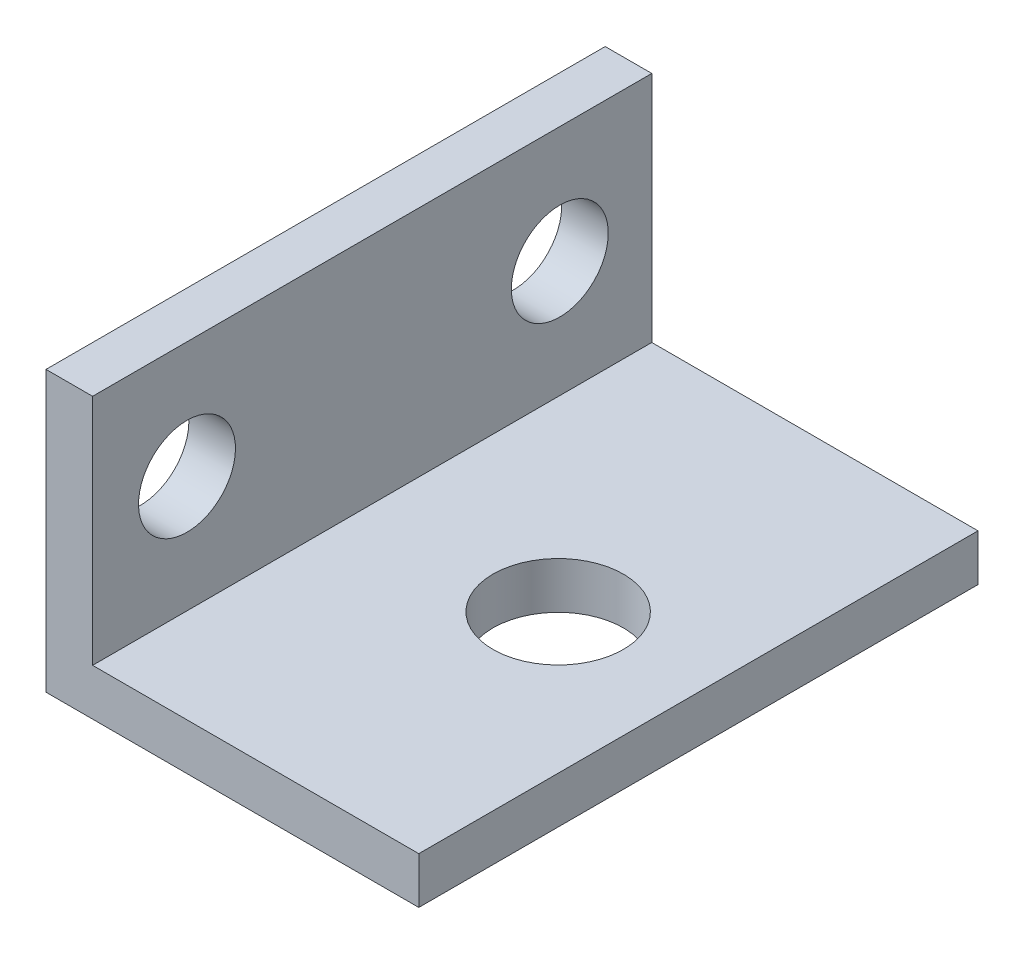
ISO-10303-21;
HEADER;
FILE_DESCRIPTION(('STEP AP214'),'2;1');
FILE_NAME('part.step','',(''),(''),'','','');
FILE_SCHEMA(('AUTOMOTIVE_DESIGN { 1 0 10303 214 1 1 1 1 }'));
ENDSEC;
DATA;
#1=APPLICATION_CONTEXT('core data for automotive mechanical design processes');
#2=APPLICATION_PROTOCOL_DEFINITION('international standard','automotive_design',2000,#1);
#3=PRODUCT_CONTEXT('',#1,'mechanical');
#4=PRODUCT('Part','Part','',(#3));
#5=PRODUCT_RELATED_PRODUCT_CATEGORY('part','',(#4));
#6=PRODUCT_DEFINITION_FORMATION('','',#4);
#7=PRODUCT_DEFINITION_CONTEXT('part definition',#1,'design');
#8=PRODUCT_DEFINITION('design','',#6,#7);
#9=PRODUCT_DEFINITION_SHAPE('','',#8);
#10=(LENGTH_UNIT() NAMED_UNIT(*) SI_UNIT(.MILLI.,.METRE.));
#11=(NAMED_UNIT(*) PLANE_ANGLE_UNIT() SI_UNIT($,.RADIAN.));
#12=(NAMED_UNIT(*) SI_UNIT($,.STERADIAN.) SOLID_ANGLE_UNIT());
#13=UNCERTAINTY_MEASURE_WITH_UNIT(LENGTH_MEASURE(1.E-05),#10,'distance_accuracy_value','');
#14=(GEOMETRIC_REPRESENTATION_CONTEXT(3) GLOBAL_UNCERTAINTY_ASSIGNED_CONTEXT((#13)) GLOBAL_UNIT_ASSIGNED_CONTEXT((#10,
#11,#12)) REPRESENTATION_CONTEXT('',''));
#15=CARTESIAN_POINT('',(0.,0.,0.));
#16=DIRECTION('',(0.,0.,1.));
#17=DIRECTION('',(1.,0.,0.));
#18=AXIS2_PLACEMENT_3D('',#15,#16,#17);
#19=CARTESIAN_POINT('',(-2.37323232323232,15.875,38.1));
#20=DIRECTION('',(0.,-1.,0.));
#21=DIRECTION('',(0.,0.,-1.));
#22=AXIS2_PLACEMENT_3D('',#19,#20,#21);
#23=PLANE('',#22);
#24=DIRECTION('',(-1.,0.,0.));
#25=VECTOR('',#24,1.);
#26=CARTESIAN_POINT('',(-2.37323232323232,15.875,0.));
#27=LINE('',#26,#25);
#28=CARTESIAN_POINT('',(-2.37323232323232,15.875,0.));
#29=VERTEX_POINT('',#28);
#30=CARTESIAN_POINT('',(-5.54823232323232,15.875,0.));
#31=VERTEX_POINT('',#30);
#32=EDGE_CURVE('E127',#29,#31,#27,.T.);
#33=ORIENTED_EDGE('',*,*,#32,.T.);
#34=DIRECTION('',(0.,0.,-1.));
#35=VECTOR('',#34,1.);
#36=CARTESIAN_POINT('',(-5.54823232323232,15.875,38.1));
#37=LINE('',#36,#35);
#38=CARTESIAN_POINT('',(-5.54823232323232,15.875,38.1));
#39=VERTEX_POINT('',#38);
#40=EDGE_CURVE('E11',#39,#31,#37,.T.);
#41=ORIENTED_EDGE('',*,*,#40,.F.);
#42=DIRECTION('',(-1.,0.,0.));
#43=VECTOR('',#42,1.);
#44=CARTESIAN_POINT('',(-2.37323232323232,15.875,38.1));
#45=LINE('',#44,#43);
#46=CARTESIAN_POINT('',(-2.37323232323232,15.875,38.1));
#47=VERTEX_POINT('',#46);
#48=EDGE_CURVE('E138',#47,#39,#45,.T.);
#49=ORIENTED_EDGE('',*,*,#48,.F.);
#50=DIRECTION('',(0.,0.,-1.));
#51=VECTOR('',#50,1.);
#52=CARTESIAN_POINT('',(-2.37323232323232,15.875,38.1));
#53=LINE('',#52,#51);
#54=EDGE_CURVE('E123',#47,#29,#53,.T.);
#55=ORIENTED_EDGE('',*,*,#54,.T.);
#56=EDGE_LOOP('',(#33,#41,#49,#55));
#57=FACE_BOUND('',#56,.T.);
#58=ADVANCED_FACE('F43',(#57),#23,.F.);
#59=CARTESIAN_POINT('',(-5.54823232323232,15.875,38.1));
#60=DIRECTION('',(1.,0.,0.));
#61=DIRECTION('',(0.,1.,0.));
#62=AXIS2_PLACEMENT_3D('',#59,#60,#61);
#63=PLANE('',#62);
#64=CARTESIAN_POINT('',(-5.54823232323232,7.9375,31.669326955366));
#65=DIRECTION('',(1.,0.,0.));
#66=DIRECTION('',(0.,1.,0.));
#67=AXIS2_PLACEMENT_3D('',#64,#65,#66);
#68=CIRCLE('',#67,3.302);
#69=CARTESIAN_POINT('',(-5.54823232323232,11.2395,31.669326955366));
#70=VERTEX_POINT('',#69);
#71=EDGE_CURVE('E238',#70,#70,#68,.T.);
#72=ORIENTED_EDGE('',*,*,#71,.T.);
#73=EDGE_LOOP('',(#72));
#74=FACE_BOUND('',#73,.T.);
#75=CARTESIAN_POINT('',(-5.54823232323232,7.9375,6.26932695536596));
#76=DIRECTION('',(1.,0.,0.));
#77=DIRECTION('',(0.,1.,0.));
#78=AXIS2_PLACEMENT_3D('',#75,#76,#77);
#79=CIRCLE('',#78,3.302);
#80=CARTESIAN_POINT('',(-5.54823232323232,11.2395,6.26932695536596));
#81=VERTEX_POINT('',#80);
#82=EDGE_CURVE('E246',#81,#81,#79,.T.);
#83=ORIENTED_EDGE('',*,*,#82,.T.);
#84=EDGE_LOOP('',(#83));
#85=FACE_BOUND('',#84,.T.);
#86=DIRECTION('',(0.,-1.,0.));
#87=VECTOR('',#86,1.);
#88=CARTESIAN_POINT('',(-5.54823232323232,15.875,0.));
#89=LINE('',#88,#87);
#90=CARTESIAN_POINT('',(-5.54823232323232,-3.175,0.));
#91=VERTEX_POINT('',#90);
#92=EDGE_CURVE('E130',#31,#91,#89,.T.);
#93=ORIENTED_EDGE('',*,*,#92,.T.);
#94=DIRECTION('',(0.,0.,-1.));
#95=VECTOR('',#94,1.);
#96=CARTESIAN_POINT('',(-5.54823232323232,-3.175,38.1));
#97=LINE('',#96,#95);
#98=CARTESIAN_POINT('',(-5.54823232323232,-3.175,38.1));
#99=VERTEX_POINT('',#98);
#100=EDGE_CURVE('E51',#99,#91,#97,.T.);
#101=ORIENTED_EDGE('',*,*,#100,.F.);
#102=DIRECTION('',(0.,-1.,0.));
#103=VECTOR('',#102,1.);
#104=CARTESIAN_POINT('',(-5.54823232323232,15.875,38.1));
#105=LINE('',#104,#103);
#106=EDGE_CURVE('E96',#39,#99,#105,.T.);
#107=ORIENTED_EDGE('',*,*,#106,.F.);
#108=ORIENTED_EDGE('',*,*,#40,.T.);
#109=EDGE_LOOP('',(#93,#101,#107,#108));
#110=FACE_BOUND('',#109,.T.);
#111=ADVANCED_FACE('F168',(#74,#85,#110),#63,.F.);
#112=CARTESIAN_POINT('',(-5.54823232323232,-3.175,38.1));
#113=DIRECTION('',(0.,1.,0.));
#114=DIRECTION('',(0.,0.,1.));
#115=AXIS2_PLACEMENT_3D('',#112,#113,#114);
#116=PLANE('',#115);
#117=CARTESIAN_POINT('',(10.3267676767677,-3.175,19.0785505134737));
#118=DIRECTION('',(0.,1.,0.));
#119=DIRECTION('',(-1.,0.,0.));
#120=AXIS2_PLACEMENT_3D('',#117,#118,#119);
#121=CIRCLE('',#120,4.445);
#122=CARTESIAN_POINT('',(5.88176767676768,-3.175,19.0785505134737));
#123=VERTEX_POINT('',#122);
#124=EDGE_CURVE('E131',#123,#123,#121,.T.);
#125=ORIENTED_EDGE('',*,*,#124,.T.);
#126=EDGE_LOOP('',(#125));
#127=FACE_BOUND('',#126,.T.);
#128=DIRECTION('',(1.,0.,0.));
#129=VECTOR('',#128,1.);
#130=CARTESIAN_POINT('',(-5.54823232323232,-3.175,0.));
#131=LINE('',#130,#129);
#132=CARTESIAN_POINT('',(19.8517676767677,-3.175,0.));
#133=VERTEX_POINT('',#132);
#134=EDGE_CURVE('E133',#91,#133,#131,.T.);
#135=ORIENTED_EDGE('',*,*,#134,.T.);
#136=DIRECTION('',(0.,0.,-1.));
#137=VECTOR('',#136,1.);
#138=CARTESIAN_POINT('',(19.8517676767677,-3.175,38.1));
#139=LINE('',#138,#137);
#140=CARTESIAN_POINT('',(19.8517676767677,-3.175,38.1));
#141=VERTEX_POINT('',#140);
#142=EDGE_CURVE('E118',#141,#133,#139,.T.);
#143=ORIENTED_EDGE('',*,*,#142,.F.);
#144=DIRECTION('',(1.,0.,0.));
#145=VECTOR('',#144,1.);
#146=CARTESIAN_POINT('',(-5.54823232323232,-3.175,38.1));
#147=LINE('',#146,#145);
#148=EDGE_CURVE('E109',#99,#141,#147,.T.);
#149=ORIENTED_EDGE('',*,*,#148,.F.);
#150=ORIENTED_EDGE('',*,*,#100,.T.);
#151=EDGE_LOOP('',(#135,#143,#149,#150));
#152=FACE_BOUND('',#151,.T.);
#153=ADVANCED_FACE('F144',(#127,#152),#116,.F.);
#154=CARTESIAN_POINT('',(19.8517676767677,-3.175,38.1));
#155=DIRECTION('',(-1.,0.,0.));
#156=DIRECTION('',(0.,0.,1.));
#157=AXIS2_PLACEMENT_3D('',#154,#155,#156);
#158=PLANE('',#157);
#159=DIRECTION('',(0.,1.,0.));
#160=VECTOR('',#159,1.);
#161=CARTESIAN_POINT('',(19.8517676767677,-3.175,0.));
#162=LINE('',#161,#160);
#163=CARTESIAN_POINT('',(19.8517676767677,0.,0.));
#164=VERTEX_POINT('',#163);
#165=EDGE_CURVE('E117',#133,#164,#162,.T.);
#166=ORIENTED_EDGE('',*,*,#165,.T.);
#167=DIRECTION('',(0.,0.,-1.));
#168=VECTOR('',#167,1.);
#169=CARTESIAN_POINT('',(19.8517676767677,0.,38.1));
#170=LINE('',#169,#168);
#171=CARTESIAN_POINT('',(19.8517676767677,0.,38.1));
#172=VERTEX_POINT('',#171);
#173=EDGE_CURVE('E114',#172,#164,#170,.T.);
#174=ORIENTED_EDGE('',*,*,#173,.F.);
#175=DIRECTION('',(0.,1.,0.));
#176=VECTOR('',#175,1.);
#177=CARTESIAN_POINT('',(19.8517676767677,-3.175,38.1));
#178=LINE('',#177,#176);
#179=EDGE_CURVE('E103',#141,#172,#178,.T.);
#180=ORIENTED_EDGE('',*,*,#179,.F.);
#181=ORIENTED_EDGE('',*,*,#142,.T.);
#182=EDGE_LOOP('',(#166,#174,#180,#181));
#183=FACE_BOUND('',#182,.T.);
#184=ADVANCED_FACE('F115',(#183),#158,.F.);
#185=CARTESIAN_POINT('',(19.8517676767677,0.,38.1));
#186=DIRECTION('',(0.,-1.,0.));
#187=DIRECTION('',(1.,0.,0.));
#188=AXIS2_PLACEMENT_3D('',#185,#186,#187);
#189=PLANE('',#188);
#190=CARTESIAN_POINT('',(10.3267676767677,0.,19.0785505134737));
#191=DIRECTION('',(0.,1.,0.));
#192=DIRECTION('',(-1.,0.,0.));
#193=AXIS2_PLACEMENT_3D('',#190,#191,#192);
#194=CIRCLE('',#193,4.445);
#195=CARTESIAN_POINT('',(5.88176767676768,0.,19.0785505134737));
#196=VERTEX_POINT('',#195);
#197=EDGE_CURVE('E243',#196,#196,#194,.T.);
#198=ORIENTED_EDGE('',*,*,#197,.F.);
#199=EDGE_LOOP('',(#198));
#200=FACE_BOUND('',#199,.T.);
#201=DIRECTION('',(-1.,0.,0.));
#202=VECTOR('',#201,1.);
#203=CARTESIAN_POINT('',(19.8517676767677,0.,0.));
#204=LINE('',#203,#202);
#205=CARTESIAN_POINT('',(-2.37323232323232,0.,0.));
#206=VERTEX_POINT('',#205);
#207=EDGE_CURVE('E82',#164,#206,#204,.T.);
#208=ORIENTED_EDGE('',*,*,#207,.T.);
#209=DIRECTION('',(0.,0.,-1.));
#210=VECTOR('',#209,1.);
#211=CARTESIAN_POINT('',(-2.37323232323232,0.,38.1));
#212=LINE('',#211,#210);
#213=CARTESIAN_POINT('',(-2.37323232323232,0.,38.1));
#214=VERTEX_POINT('',#213);
#215=EDGE_CURVE('E119',#214,#206,#212,.T.);
#216=ORIENTED_EDGE('',*,*,#215,.F.);
#217=DIRECTION('',(-1.,0.,0.));
#218=VECTOR('',#217,1.);
#219=CARTESIAN_POINT('',(19.8517676767677,0.,38.1));
#220=LINE('',#219,#218);
#221=EDGE_CURVE('E107',#172,#214,#220,.T.);
#222=ORIENTED_EDGE('',*,*,#221,.F.);
#223=ORIENTED_EDGE('',*,*,#173,.T.);
#224=EDGE_LOOP('',(#208,#216,#222,#223));
#225=FACE_BOUND('',#224,.T.);
#226=ADVANCED_FACE('F121',(#200,#225),#189,.F.);
#227=CARTESIAN_POINT('',(-2.37323232323232,0.,38.1));
#228=DIRECTION('',(-1.,0.,0.));
#229=DIRECTION('',(0.,-1.,0.));
#230=AXIS2_PLACEMENT_3D('',#227,#228,#229);
#231=PLANE('',#230);
#232=CARTESIAN_POINT('',(-2.37323232323232,7.9375,31.669326955366));
#233=DIRECTION('',(1.,0.,0.));
#234=DIRECTION('',(0.,1.,0.));
#235=AXIS2_PLACEMENT_3D('',#232,#233,#234);
#236=CIRCLE('',#235,3.302);
#237=CARTESIAN_POINT('',(-2.37323232323232,11.2395,31.669326955366));
#238=VERTEX_POINT('',#237);
#239=EDGE_CURVE('E240',#238,#238,#236,.T.);
#240=ORIENTED_EDGE('',*,*,#239,.F.);
#241=EDGE_LOOP('',(#240));
#242=FACE_BOUND('',#241,.T.);
#243=CARTESIAN_POINT('',(-2.37323232323232,7.9375,6.26932695536596));
#244=DIRECTION('',(1.,0.,0.));
#245=DIRECTION('',(0.,1.,0.));
#246=AXIS2_PLACEMENT_3D('',#243,#244,#245);
#247=CIRCLE('',#246,3.302);
#248=CARTESIAN_POINT('',(-2.37323232323232,11.2395,6.26932695536596));
#249=VERTEX_POINT('',#248);
#250=EDGE_CURVE('E241',#249,#249,#247,.T.);
#251=ORIENTED_EDGE('',*,*,#250,.F.);
#252=EDGE_LOOP('',(#251));
#253=FACE_BOUND('',#252,.T.);
#254=DIRECTION('',(0.,1.,0.));
#255=VECTOR('',#254,1.);
#256=CARTESIAN_POINT('',(-2.37323232323232,0.,0.));
#257=LINE('',#256,#255);
#258=EDGE_CURVE('E88',#206,#29,#257,.T.);
#259=ORIENTED_EDGE('',*,*,#258,.T.);
#260=ORIENTED_EDGE('',*,*,#54,.F.);
#261=DIRECTION('',(0.,1.,0.));
#262=VECTOR('',#261,1.);
#263=CARTESIAN_POINT('',(-2.37323232323232,0.,38.1));
#264=LINE('',#263,#262);
#265=EDGE_CURVE('E59',#214,#47,#264,.T.);
#266=ORIENTED_EDGE('',*,*,#265,.F.);
#267=ORIENTED_EDGE('',*,*,#215,.T.);
#268=EDGE_LOOP('',(#259,#260,#266,#267));
#269=FACE_BOUND('',#268,.T.);
#270=ADVANCED_FACE('F151',(#242,#253,#269),#231,.F.);
#271=CARTESIAN_POINT('',(0.,0.,38.1));
#272=DIRECTION('',(0.,0.,1.));
#273=DIRECTION('',(1.,0.,0.));
#274=AXIS2_PLACEMENT_3D('',#271,#272,#273);
#275=PLANE('',#274);
#276=ORIENTED_EDGE('',*,*,#48,.T.);
#277=ORIENTED_EDGE('',*,*,#106,.T.);
#278=ORIENTED_EDGE('',*,*,#148,.T.);
#279=ORIENTED_EDGE('',*,*,#179,.T.);
#280=ORIENTED_EDGE('',*,*,#221,.T.);
#281=ORIENTED_EDGE('',*,*,#265,.T.);
#282=EDGE_LOOP('',(#276,#277,#278,#279,#280,#281));
#283=FACE_BOUND('',#282,.T.);
#284=ADVANCED_FACE('F105',(#283),#275,.T.);
#285=CARTESIAN_POINT('',(0.,0.,0.));
#286=DIRECTION('',(0.,0.,1.));
#287=DIRECTION('',(1.,0.,0.));
#288=AXIS2_PLACEMENT_3D('',#285,#286,#287);
#289=PLANE('',#288);
#290=ORIENTED_EDGE('',*,*,#32,.F.);
#291=ORIENTED_EDGE('',*,*,#258,.F.);
#292=ORIENTED_EDGE('',*,*,#207,.F.);
#293=ORIENTED_EDGE('',*,*,#165,.F.);
#294=ORIENTED_EDGE('',*,*,#134,.F.);
#295=ORIENTED_EDGE('',*,*,#92,.F.);
#296=EDGE_LOOP('',(#290,#291,#292,#293,#294,#295));
#297=FACE_BOUND('',#296,.T.);
#298=ADVANCED_FACE('F147',(#297),#289,.F.);
#299=CARTESIAN_POINT('',(10.3267676767677,-3.175,19.0785505134737));
#300=DIRECTION('',(0.,1.,0.));
#301=DIRECTION('',(-1.,0.,0.));
#302=AXIS2_PLACEMENT_3D('',#299,#300,#301);
#303=CYLINDRICAL_SURFACE('',#302,4.445);
#304=CARTESIAN_POINT('',(5.88176767676768,-3.175,19.0785505134737));
#305=CARTESIAN_POINT('',(5.88176767676768,-3.14192708333334,19.0785505134737));
#306=CARTESIAN_POINT('',(5.88176767676768,-3.10885416666667,19.0785505134737));
#307=CARTESIAN_POINT('',(5.88176767676768,-3.04270833333334,19.0785505134737));
#308=CARTESIAN_POINT('',(5.88176767676768,-3.00963541666667,19.0785505134737));
#309=CARTESIAN_POINT('',(5.88176767676768,-2.94348958333334,19.0785505134737));
#310=CARTESIAN_POINT('',(5.88176767676768,-2.91041666666667,19.0785505134737));
#311=CARTESIAN_POINT('',(5.88176767676768,-2.84427083333334,19.0785505134737));
#312=CARTESIAN_POINT('',(5.88176767676768,-2.81119791666667,19.0785505134737));
#313=CARTESIAN_POINT('',(5.88176767676768,-2.74505208333334,19.0785505134737));
#314=CARTESIAN_POINT('',(5.88176767676768,-2.71197916666667,19.0785505134737));
#315=CARTESIAN_POINT('',(5.88176767676768,-2.64583333333334,19.0785505134737));
#316=CARTESIAN_POINT('',(5.88176767676768,-2.61276041666667,19.0785505134737));
#317=CARTESIAN_POINT('',(5.88176767676768,-2.54661458333334,19.0785505134737));
#318=CARTESIAN_POINT('',(5.88176767676768,-2.51354166666667,19.0785505134737));
#319=CARTESIAN_POINT('',(5.88176767676768,-2.44739583333334,19.0785505134737));
#320=CARTESIAN_POINT('',(5.88176767676768,-2.41432291666667,19.0785505134737));
#321=CARTESIAN_POINT('',(5.88176767676768,-2.34817708333334,19.0785505134737));
#322=CARTESIAN_POINT('',(5.88176767676768,-2.31510416666667,19.0785505134737));
#323=CARTESIAN_POINT('',(5.88176767676768,-2.24895833333334,19.0785505134737));
#324=CARTESIAN_POINT('',(5.88176767676768,-2.21588541666667,19.0785505134737));
#325=CARTESIAN_POINT('',(5.88176767676768,-2.14973958333334,19.0785505134737));
#326=CARTESIAN_POINT('',(5.88176767676768,-2.11666666666667,19.0785505134737));
#327=CARTESIAN_POINT('',(5.88176767676768,-2.05052083333334,19.0785505134737));
#328=CARTESIAN_POINT('',(5.88176767676768,-2.01744791666667,19.0785505134737));
#329=CARTESIAN_POINT('',(5.88176767676768,-1.95130208333333,19.0785505134737));
#330=CARTESIAN_POINT('',(5.88176767676768,-1.91822916666667,19.0785505134737));
#331=CARTESIAN_POINT('',(5.88176767676768,-1.85208333333333,19.0785505134737));
#332=CARTESIAN_POINT('',(5.88176767676768,-1.81901041666667,19.0785505134737));
#333=CARTESIAN_POINT('',(5.88176767676768,-1.75286458333333,19.0785505134737));
#334=CARTESIAN_POINT('',(5.88176767676768,-1.71979166666667,19.0785505134737));
#335=CARTESIAN_POINT('',(5.88176767676768,-1.65364583333333,19.0785505134737));
#336=CARTESIAN_POINT('',(5.88176767676768,-1.62057291666667,19.0785505134737));
#337=CARTESIAN_POINT('',(5.88176767676768,-1.55442708333333,19.0785505134737));
#338=CARTESIAN_POINT('',(5.88176767676768,-1.52135416666667,19.0785505134737));
#339=CARTESIAN_POINT('',(5.88176767676768,-1.45520833333333,19.0785505134737));
#340=CARTESIAN_POINT('',(5.88176767676768,-1.42213541666667,19.0785505134737));
#341=CARTESIAN_POINT('',(5.88176767676768,-1.35598958333333,19.0785505134737));
#342=CARTESIAN_POINT('',(5.88176767676768,-1.32291666666667,19.0785505134737));
#343=CARTESIAN_POINT('',(5.88176767676768,-1.25677083333333,19.0785505134737));
#344=CARTESIAN_POINT('',(5.88176767676768,-1.22369791666667,19.0785505134737));
#345=CARTESIAN_POINT('',(5.88176767676768,-1.15755208333333,19.0785505134737));
#346=CARTESIAN_POINT('',(5.88176767676768,-1.12447916666667,19.0785505134737));
#347=CARTESIAN_POINT('',(5.88176767676768,-1.05833333333333,19.0785505134737));
#348=CARTESIAN_POINT('',(5.88176767676768,-1.02526041666667,19.0785505134737));
#349=CARTESIAN_POINT('',(5.88176767676768,-0.959114583333334,19.0785505134737));
#350=CARTESIAN_POINT('',(5.88176767676768,-0.926041666666667,19.0785505134737));
#351=CARTESIAN_POINT('',(5.88176767676768,-0.859895833333334,19.0785505134737));
#352=CARTESIAN_POINT('',(5.88176767676768,-0.826822916666667,19.0785505134737));
#353=CARTESIAN_POINT('',(5.88176767676768,-0.760677083333334,19.0785505134737));
#354=CARTESIAN_POINT('',(5.88176767676768,-0.727604166666667,19.0785505134737));
#355=CARTESIAN_POINT('',(5.88176767676768,-0.661458333333333,19.0785505134737));
#356=CARTESIAN_POINT('',(5.88176767676768,-0.628385416666667,19.0785505134737));
#357=CARTESIAN_POINT('',(5.88176767676768,-0.562239583333333,19.0785505134737));
#358=CARTESIAN_POINT('',(5.88176767676768,-0.529166666666667,19.0785505134737));
#359=CARTESIAN_POINT('',(5.88176767676768,-0.463020833333333,19.0785505134737));
#360=CARTESIAN_POINT('',(5.88176767676768,-0.429947916666666,19.0785505134737));
#361=CARTESIAN_POINT('',(5.88176767676768,-0.363802083333333,19.0785505134737));
#362=CARTESIAN_POINT('',(5.88176767676768,-0.330729166666666,19.0785505134737));
#363=CARTESIAN_POINT('',(5.88176767676768,-0.264583333333333,19.0785505134737));
#364=CARTESIAN_POINT('',(5.88176767676768,-0.231510416666666,19.0785505134737));
#365=CARTESIAN_POINT('',(5.88176767676768,-0.165364583333333,19.0785505134737));
#366=CARTESIAN_POINT('',(5.88176767676768,-0.132291666666666,19.0785505134737));
#367=CARTESIAN_POINT('',(5.88176767676768,-0.0661458333333327,19.0785505134737));
#368=CARTESIAN_POINT('',(5.88176767676768,-0.0330729166666658,19.0785505134737));
#369=CARTESIAN_POINT('',(5.88176767676768,0.,19.0785505134737));
#370=B_SPLINE_CURVE_WITH_KNOTS('',3,(#304,#305,#306,#307,#308,#309,#310,#311,#312,#313,#314,
#315,#316,#317,#318,#319,#320,#321,#322,#323,#324,#325,#326,#327,#328,#329,#330,#331,#332,#333,
#334,#335,#336,#337,#338,#339,#340,#341,#342,#343,#344,#345,#346,#347,#348,#349,#350,#351,#352,
#353,#354,#355,#356,#357,#358,#359,#360,#361,#362,#363,#364,#365,#366,#367,#368,#369),
.UNSPECIFIED.,.F.,.F.,(4,2,2,2,2,2,2,2,2,2,2,2,2,2,2,2,2,2,2,2,2,2,2,2,2,2,2,2,2,2,2,2,4),(0.,
0.0992187500000004,0.198437500000001,0.297656250000001,0.396875000000001,0.496093750000001,
0.595312500000001,0.694531250000001,0.793750000000002,0.892968750000001,0.992187500000001,
1.09140625,1.190625,1.28984375,1.3890625,1.48828125,1.5875,1.68671875,1.7859375,1.88515625,
1.984375,2.08359375,2.1828125,2.28203125,2.38125,2.48046875,2.5796875,2.67890625,2.778125,
2.87734375,2.9765625,3.07578125,3.175),.UNSPECIFIED.);
#371=EDGE_CURVE('BSEAM197',#123,#196,#370,.T.);
#372=ORIENTED_EDGE('',*,*,#124,.F.);
#373=ORIENTED_EDGE('',*,*,#197,.T.);
#374=ORIENTED_EDGE('',*,*,#371,.T.);
#375=ORIENTED_EDGE('',*,*,#371,.F.);
#376=EDGE_LOOP('',(#372,#374,#373,#375));
#377=FACE_BOUND('',#376,.T.);
#378=ADVANCED_FACE('F197',(#377),#303,.F.);
#379=CARTESIAN_POINT('',(-5.54823232323232,7.9375,6.26932695536596));
#380=DIRECTION('',(1.,0.,0.));
#381=DIRECTION('',(0.,1.,0.));
#382=AXIS2_PLACEMENT_3D('',#379,#380,#381);
#383=CYLINDRICAL_SURFACE('',#382,3.302);
#384=ORIENTED_EDGE('',*,*,#82,.F.);
#385=EDGE_LOOP('',(#384));
#386=FACE_BOUND('',#385,.T.);
#387=ORIENTED_EDGE('',*,*,#250,.T.);
#388=EDGE_LOOP('',(#387));
#389=FACE_BOUND('',#388,.T.);
#390=ADVANCED_FACE('F211',(#386,#389),#383,.F.);
#391=CARTESIAN_POINT('',(-5.54823232323232,7.9375,31.669326955366));
#392=DIRECTION('',(1.,0.,0.));
#393=DIRECTION('',(0.,1.,0.));
#394=AXIS2_PLACEMENT_3D('',#391,#392,#393);
#395=CYLINDRICAL_SURFACE('',#394,3.302);
#396=ORIENTED_EDGE('',*,*,#71,.F.);
#397=EDGE_LOOP('',(#396));
#398=FACE_BOUND('',#397,.T.);
#399=ORIENTED_EDGE('',*,*,#239,.T.);
#400=EDGE_LOOP('',(#399));
#401=FACE_BOUND('',#400,.T.);
#402=ADVANCED_FACE('F223',(#398,#401),#395,.F.);
#403=CLOSED_SHELL('',(#58,#111,#153,#184,#226,#270,#284,#298,#378,#390,#402));
#404=MANIFOLD_SOLID_BREP('B2',#403);
#405=ADVANCED_BREP_SHAPE_REPRESENTATION('',(#18,#404),#14);
#406=SHAPE_DEFINITION_REPRESENTATION(#9,#405);
ENDSEC;
END-ISO-10303-21;
